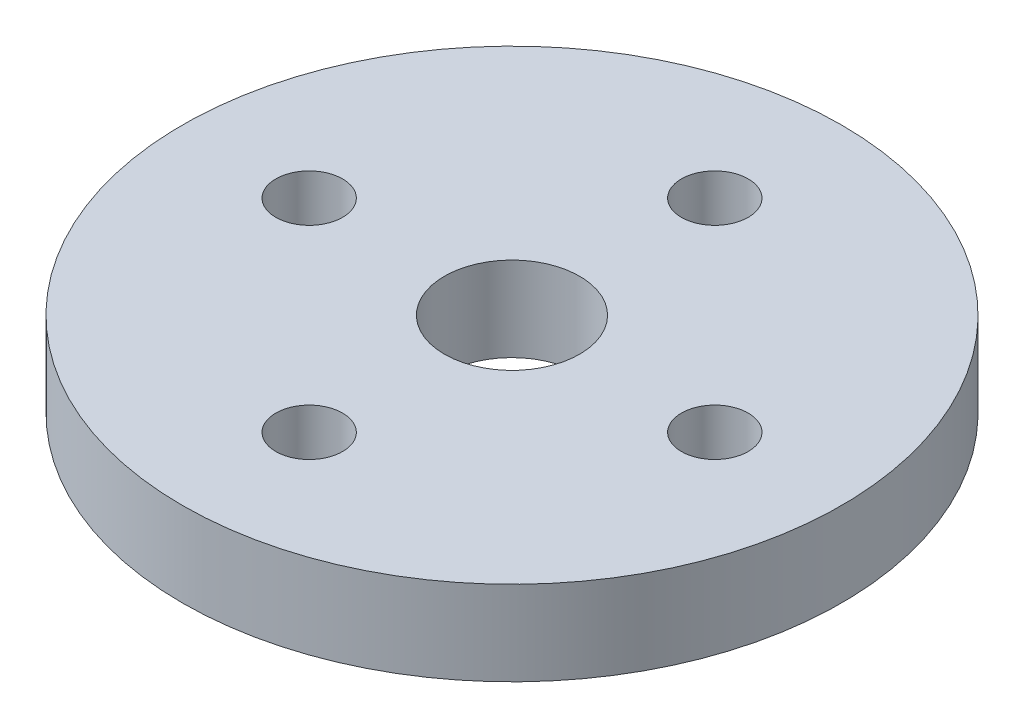
ISO-10303-21;
HEADER;
FILE_DESCRIPTION(('STEP AP214'),'2;1');
FILE_NAME('part.step','',(''),(''),'','','');
FILE_SCHEMA(('AUTOMOTIVE_DESIGN { 1 0 10303 214 1 1 1 1 }'));
ENDSEC;
DATA;
#1=APPLICATION_CONTEXT('core data for automotive mechanical design processes');
#2=APPLICATION_PROTOCOL_DEFINITION('international standard','automotive_design',2000,#1);
#3=PRODUCT_CONTEXT('',#1,'mechanical');
#4=PRODUCT('Part','Part','',(#3));
#5=PRODUCT_RELATED_PRODUCT_CATEGORY('part','',(#4));
#6=PRODUCT_DEFINITION_FORMATION('','',#4);
#7=PRODUCT_DEFINITION_CONTEXT('part definition',#1,'design');
#8=PRODUCT_DEFINITION('design','',#6,#7);
#9=PRODUCT_DEFINITION_SHAPE('','',#8);
#10=(LENGTH_UNIT() NAMED_UNIT(*) SI_UNIT(.MILLI.,.METRE.));
#11=(NAMED_UNIT(*) PLANE_ANGLE_UNIT() SI_UNIT($,.RADIAN.));
#12=(NAMED_UNIT(*) SI_UNIT($,.STERADIAN.) SOLID_ANGLE_UNIT());
#13=UNCERTAINTY_MEASURE_WITH_UNIT(LENGTH_MEASURE(1.E-05),#10,'distance_accuracy_value','');
#14=(GEOMETRIC_REPRESENTATION_CONTEXT(3) GLOBAL_UNCERTAINTY_ASSIGNED_CONTEXT((#13)) GLOBAL_UNIT_ASSIGNED_CONTEXT((#10,
#11,#12)) REPRESENTATION_CONTEXT('',''));
#15=CARTESIAN_POINT('',(0.,0.,0.));
#16=DIRECTION('',(0.,0.,1.));
#17=DIRECTION('',(1.,0.,0.));
#18=AXIS2_PLACEMENT_3D('',#15,#16,#17);
#19=CARTESIAN_POINT('',(0.,5.,0.));
#20=DIRECTION('',(0.,1.,0.));
#21=DIRECTION('',(0.,0.,1.));
#22=AXIS2_PLACEMENT_3D('',#19,#20,#21);
#23=PLANE('',#22);
#24=CARTESIAN_POINT('',(6.78630782952126E-13,5.,12.));
#25=DIRECTION('',(0.,1.,0.));
#26=DIRECTION('',(0.,0.,1.));
#27=AXIS2_PLACEMENT_3D('',#24,#25,#26);
#28=CIRCLE('',#27,1.975);
#29=CARTESIAN_POINT('',(6.78630782952126E-13,5.,13.975));
#30=VERTEX_POINT('',#29);
#31=EDGE_CURVE('E63',#30,#30,#28,.T.);
#32=ORIENTED_EDGE('',*,*,#31,.F.);
#33=EDGE_LOOP('',(#32));
#34=FACE_BOUND('',#33,.T.);
#35=CARTESIAN_POINT('',(0.,5.,-12.));
#36=DIRECTION('',(0.,1.,0.));
#37=DIRECTION('',(0.,0.,1.));
#38=AXIS2_PLACEMENT_3D('',#35,#36,#37);
#39=CIRCLE('',#38,1.975);
#40=CARTESIAN_POINT('',(0.,5.,-10.025));
#41=VERTEX_POINT('',#40);
#42=EDGE_CURVE('E51',#41,#41,#39,.T.);
#43=ORIENTED_EDGE('',*,*,#42,.F.);
#44=EDGE_LOOP('',(#43));
#45=FACE_BOUND('',#44,.T.);
#46=CARTESIAN_POINT('',(0.,5.,0.));
#47=DIRECTION('',(0.,1.,0.));
#48=DIRECTION('',(0.,0.,1.));
#49=AXIS2_PLACEMENT_3D('',#46,#47,#48);
#50=CIRCLE('',#49,19.5);
#51=CARTESIAN_POINT('',(0.,5.,19.5));
#52=VERTEX_POINT('',#51);
#53=EDGE_CURVE('E10',#52,#52,#50,.T.);
#54=ORIENTED_EDGE('',*,*,#53,.T.);
#55=EDGE_LOOP('',(#54));
#56=FACE_BOUND('',#55,.T.);
#57=CARTESIAN_POINT('',(0.,5.,0.));
#58=DIRECTION('',(0.,1.,0.));
#59=DIRECTION('',(0.,0.,1.));
#60=AXIS2_PLACEMENT_3D('',#57,#58,#59);
#61=CIRCLE('',#60,4.);
#62=CARTESIAN_POINT('',(0.,5.,4.));
#63=VERTEX_POINT('',#62);
#64=EDGE_CURVE('E46',#63,#63,#61,.T.);
#65=ORIENTED_EDGE('',*,*,#64,.F.);
#66=EDGE_LOOP('',(#65));
#67=FACE_BOUND('',#66,.T.);
#68=CARTESIAN_POINT('',(12.0000000000003,5.,-3.38856148926383E-13));
#69=DIRECTION('',(0.,1.,0.));
#70=DIRECTION('',(0.,0.,1.));
#71=AXIS2_PLACEMENT_3D('',#68,#69,#70);
#72=CIRCLE('',#71,1.975);
#73=CARTESIAN_POINT('',(12.0000000000003,5.,1.97499999999966));
#74=VERTEX_POINT('',#73);
#75=EDGE_CURVE('E57',#74,#74,#72,.T.);
#76=ORIENTED_EDGE('',*,*,#75,.F.);
#77=EDGE_LOOP('',(#76));
#78=FACE_BOUND('',#77,.T.);
#79=CARTESIAN_POINT('',(-11.9999999999997,5.,3.4032572508536E-13));
#80=DIRECTION('',(0.,1.,0.));
#81=DIRECTION('',(0.,0.,1.));
#82=AXIS2_PLACEMENT_3D('',#79,#80,#81);
#83=CIRCLE('',#82,1.975);
#84=CARTESIAN_POINT('',(-11.9999999999997,5.,1.97500000000034));
#85=VERTEX_POINT('',#84);
#86=EDGE_CURVE('E69',#85,#85,#83,.T.);
#87=ORIENTED_EDGE('',*,*,#86,.F.);
#88=EDGE_LOOP('',(#87));
#89=FACE_BOUND('',#88,.T.);
#90=ADVANCED_FACE('F35',(#34,#45,#56,#67,#78,#89),#23,.T.);
#91=CARTESIAN_POINT('',(0.,0.,0.));
#92=DIRECTION('',(0.,1.,0.));
#93=DIRECTION('',(0.,0.,1.));
#94=AXIS2_PLACEMENT_3D('',#91,#92,#93);
#95=PLANE('',#94);
#96=CARTESIAN_POINT('',(0.,0.,0.));
#97=DIRECTION('',(0.,1.,0.));
#98=DIRECTION('',(0.,0.,1.));
#99=AXIS2_PLACEMENT_3D('',#96,#97,#98);
#100=CIRCLE('',#99,19.5);
#101=CARTESIAN_POINT('',(0.,0.,19.5));
#102=VERTEX_POINT('',#101);
#103=EDGE_CURVE('E39',#102,#102,#100,.T.);
#104=ORIENTED_EDGE('',*,*,#103,.F.);
#105=EDGE_LOOP('',(#104));
#106=FACE_BOUND('',#105,.T.);
#107=CARTESIAN_POINT('',(0.,0.,0.));
#108=DIRECTION('',(0.,1.,0.));
#109=DIRECTION('',(0.,0.,1.));
#110=AXIS2_PLACEMENT_3D('',#107,#108,#109);
#111=CIRCLE('',#110,4.);
#112=CARTESIAN_POINT('',(0.,0.,4.));
#113=VERTEX_POINT('',#112);
#114=EDGE_CURVE('E48',#113,#113,#111,.T.);
#115=ORIENTED_EDGE('',*,*,#114,.T.);
#116=EDGE_LOOP('',(#115));
#117=FACE_BOUND('',#116,.T.);
#118=CARTESIAN_POINT('',(0.,0.,-12.));
#119=DIRECTION('',(0.,1.,0.));
#120=DIRECTION('',(0.,0.,1.));
#121=AXIS2_PLACEMENT_3D('',#118,#119,#120);
#122=CIRCLE('',#121,1.975);
#123=CARTESIAN_POINT('',(0.,0.,-10.025));
#124=VERTEX_POINT('',#123);
#125=EDGE_CURVE('E54',#124,#124,#122,.T.);
#126=ORIENTED_EDGE('',*,*,#125,.T.);
#127=EDGE_LOOP('',(#126));
#128=FACE_BOUND('',#127,.T.);
#129=CARTESIAN_POINT('',(12.0000000000003,0.,-3.38856148926383E-13));
#130=DIRECTION('',(0.,1.,0.));
#131=DIRECTION('',(0.,0.,1.));
#132=AXIS2_PLACEMENT_3D('',#129,#130,#131);
#133=CIRCLE('',#132,1.975);
#134=CARTESIAN_POINT('',(12.0000000000003,0.,1.97499999999966));
#135=VERTEX_POINT('',#134);
#136=EDGE_CURVE('E60',#135,#135,#133,.T.);
#137=ORIENTED_EDGE('',*,*,#136,.T.);
#138=EDGE_LOOP('',(#137));
#139=FACE_BOUND('',#138,.T.);
#140=CARTESIAN_POINT('',(6.78630782952126E-13,0.,12.));
#141=DIRECTION('',(0.,1.,0.));
#142=DIRECTION('',(0.,0.,1.));
#143=AXIS2_PLACEMENT_3D('',#140,#141,#142);
#144=CIRCLE('',#143,1.975);
#145=CARTESIAN_POINT('',(6.78630782952126E-13,0.,13.975));
#146=VERTEX_POINT('',#145);
#147=EDGE_CURVE('E66',#146,#146,#144,.T.);
#148=ORIENTED_EDGE('',*,*,#147,.T.);
#149=EDGE_LOOP('',(#148));
#150=FACE_BOUND('',#149,.T.);
#151=CARTESIAN_POINT('',(-11.9999999999997,0.,3.4032572508536E-13));
#152=DIRECTION('',(0.,1.,0.));
#153=DIRECTION('',(0.,0.,1.));
#154=AXIS2_PLACEMENT_3D('',#151,#152,#153);
#155=CIRCLE('',#154,1.975);
#156=CARTESIAN_POINT('',(-11.9999999999997,0.,1.97500000000034));
#157=VERTEX_POINT('',#156);
#158=EDGE_CURVE('E72',#157,#157,#155,.T.);
#159=ORIENTED_EDGE('',*,*,#158,.T.);
#160=EDGE_LOOP('',(#159));
#161=FACE_BOUND('',#160,.T.);
#162=ADVANCED_FACE('F82',(#106,#117,#128,#139,#150,#161),#95,.F.);
#163=CARTESIAN_POINT('',(0.,5.,0.));
#164=DIRECTION('',(0.,-1.,0.));
#165=DIRECTION('',(0.,0.,-1.));
#166=AXIS2_PLACEMENT_3D('',#163,#164,#165);
#167=CYLINDRICAL_SURFACE('',#166,19.5);
#168=ORIENTED_EDGE('',*,*,#53,.F.);
#169=EDGE_LOOP('',(#168));
#170=FACE_BOUND('',#169,.T.);
#171=ORIENTED_EDGE('',*,*,#103,.T.);
#172=EDGE_LOOP('',(#171));
#173=FACE_BOUND('',#172,.T.);
#174=ADVANCED_FACE('F37',(#170,#173),#167,.T.);
#175=CARTESIAN_POINT('',(0.,5.,0.));
#176=DIRECTION('',(0.,-1.,0.));
#177=DIRECTION('',(0.,0.,-1.));
#178=AXIS2_PLACEMENT_3D('',#175,#176,#177);
#179=CYLINDRICAL_SURFACE('',#178,4.);
#180=ORIENTED_EDGE('',*,*,#64,.T.);
#181=EDGE_LOOP('',(#180));
#182=FACE_BOUND('',#181,.T.);
#183=ORIENTED_EDGE('',*,*,#114,.F.);
#184=EDGE_LOOP('',(#183));
#185=FACE_BOUND('',#184,.T.);
#186=ADVANCED_FACE('F92',(#182,#185),#179,.F.);
#187=CARTESIAN_POINT('',(0.,5.,-12.));
#188=DIRECTION('',(0.,-1.,0.));
#189=DIRECTION('',(0.,0.,-1.));
#190=AXIS2_PLACEMENT_3D('',#187,#188,#189);
#191=CYLINDRICAL_SURFACE('',#190,1.975);
#192=ORIENTED_EDGE('',*,*,#42,.T.);
#193=EDGE_LOOP('',(#192));
#194=FACE_BOUND('',#193,.T.);
#195=ORIENTED_EDGE('',*,*,#125,.F.);
#196=EDGE_LOOP('',(#195));
#197=FACE_BOUND('',#196,.T.);
#198=ADVANCED_FACE('F95',(#194,#197),#191,.F.);
#199=CARTESIAN_POINT('',(12.0000000000003,5.,-3.38856148926383E-13));
#200=DIRECTION('',(0.,-1.,0.));
#201=DIRECTION('',(0.,0.,-1.));
#202=AXIS2_PLACEMENT_3D('',#199,#200,#201);
#203=CYLINDRICAL_SURFACE('',#202,1.975);
#204=ORIENTED_EDGE('',*,*,#75,.T.);
#205=EDGE_LOOP('',(#204));
#206=FACE_BOUND('',#205,.T.);
#207=ORIENTED_EDGE('',*,*,#136,.F.);
#208=EDGE_LOOP('',(#207));
#209=FACE_BOUND('',#208,.T.);
#210=ADVANCED_FACE('F99',(#206,#209),#203,.F.);
#211=CARTESIAN_POINT('',(6.78630782952126E-13,5.,12.));
#212=DIRECTION('',(0.,-1.,0.));
#213=DIRECTION('',(0.,0.,-1.));
#214=AXIS2_PLACEMENT_3D('',#211,#212,#213);
#215=CYLINDRICAL_SURFACE('',#214,1.975);
#216=ORIENTED_EDGE('',*,*,#31,.T.);
#217=EDGE_LOOP('',(#216));
#218=FACE_BOUND('',#217,.T.);
#219=ORIENTED_EDGE('',*,*,#147,.F.);
#220=EDGE_LOOP('',(#219));
#221=FACE_BOUND('',#220,.T.);
#222=ADVANCED_FACE('F103',(#218,#221),#215,.F.);
#223=CARTESIAN_POINT('',(-11.9999999999997,5.,3.4032572508536E-13));
#224=DIRECTION('',(0.,-1.,0.));
#225=DIRECTION('',(0.,0.,-1.));
#226=AXIS2_PLACEMENT_3D('',#223,#224,#225);
#227=CYLINDRICAL_SURFACE('',#226,1.975);
#228=ORIENTED_EDGE('',*,*,#86,.T.);
#229=EDGE_LOOP('',(#228));
#230=FACE_BOUND('',#229,.T.);
#231=ORIENTED_EDGE('',*,*,#158,.F.);
#232=EDGE_LOOP('',(#231));
#233=FACE_BOUND('',#232,.T.);
#234=ADVANCED_FACE('F78',(#230,#233),#227,.F.);
#235=CLOSED_SHELL('',(#90,#162,#174,#186,#198,#210,#222,#234));
#236=MANIFOLD_SOLID_BREP('B2',#235);
#237=ADVANCED_BREP_SHAPE_REPRESENTATION('',(#18,#236),#14);
#238=SHAPE_DEFINITION_REPRESENTATION(#9,#237);
ENDSEC;
END-ISO-10303-21;
